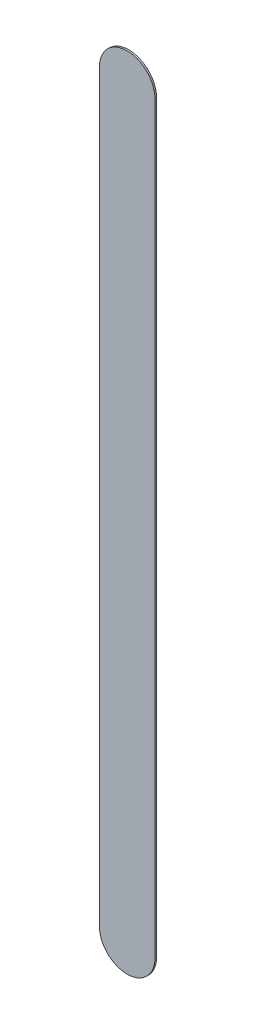
ISO-10303-21;
HEADER;
FILE_DESCRIPTION(('STEP AP214'),'2;1');
FILE_NAME('part.step','',(''),(''),'','','');
FILE_SCHEMA(('AUTOMOTIVE_DESIGN { 1 0 10303 214 1 1 1 1 }'));
ENDSEC;
DATA;
#1=APPLICATION_CONTEXT('core data for automotive mechanical design processes');
#2=APPLICATION_PROTOCOL_DEFINITION('international standard','automotive_design',2000,#1);
#3=PRODUCT_CONTEXT('',#1,'mechanical');
#4=PRODUCT('Part','Part','',(#3));
#5=PRODUCT_RELATED_PRODUCT_CATEGORY('part','',(#4));
#6=PRODUCT_DEFINITION_FORMATION('','',#4);
#7=PRODUCT_DEFINITION_CONTEXT('part definition',#1,'design');
#8=PRODUCT_DEFINITION('design','',#6,#7);
#9=PRODUCT_DEFINITION_SHAPE('','',#8);
#10=(LENGTH_UNIT() NAMED_UNIT(*) SI_UNIT(.MILLI.,.METRE.));
#11=(NAMED_UNIT(*) PLANE_ANGLE_UNIT() SI_UNIT($,.RADIAN.));
#12=(NAMED_UNIT(*) SI_UNIT($,.STERADIAN.) SOLID_ANGLE_UNIT());
#13=UNCERTAINTY_MEASURE_WITH_UNIT(LENGTH_MEASURE(1.E-05),#10,'distance_accuracy_value','');
#14=(GEOMETRIC_REPRESENTATION_CONTEXT(3) GLOBAL_UNCERTAINTY_ASSIGNED_CONTEXT((#13)) GLOBAL_UNIT_ASSIGNED_CONTEXT((#10,
#11,#12)) REPRESENTATION_CONTEXT('',''));
#15=CARTESIAN_POINT('',(0.,0.,0.));
#16=DIRECTION('',(0.,0.,1.));
#17=DIRECTION('',(1.,0.,0.));
#18=AXIS2_PLACEMENT_3D('',#15,#16,#17);
#19=CARTESIAN_POINT('',(122.99999784,77.04001864,0.));
#20=DIRECTION('',(-1.,0.,0.));
#21=DIRECTION('',(0.,1.,0.));
#22=AXIS2_PLACEMENT_3D('',#19,#20,#21);
#23=PLANE('',#22);
#24=DIRECTION('',(0.,1.,0.));
#25=VECTOR('',#24,1.);
#26=CARTESIAN_POINT('',(122.99999784,77.04001864,0.03556));
#27=LINE('',#26,#25);
#28=CARTESIAN_POINT('',(122.99999784,77.04001864,0.03556));
#29=VERTEX_POINT('',#28);
#30=CARTESIAN_POINT('',(122.99999784,93.10005256,0.03556));
#31=VERTEX_POINT('',#30);
#32=EDGE_CURVE('E11',#29,#31,#27,.T.);
#33=ORIENTED_EDGE('',*,*,#32,.F.);
#34=DIRECTION('',(0.,0.,1.));
#35=VECTOR('',#34,1.);
#36=CARTESIAN_POINT('',(122.99999784,77.04001864,0.));
#37=LINE('',#36,#35);
#38=CARTESIAN_POINT('',(122.99999784,77.04001864,0.));
#39=VERTEX_POINT('',#38);
#40=EDGE_CURVE('E24',#39,#29,#37,.T.);
#41=ORIENTED_EDGE('',*,*,#40,.F.);
#42=DIRECTION('',(0.,1.,0.));
#43=VECTOR('',#42,1.);
#44=CARTESIAN_POINT('',(122.99999784,77.04001864,0.));
#45=LINE('',#44,#43);
#46=CARTESIAN_POINT('',(122.99999784,93.10005256,0.));
#47=VERTEX_POINT('',#46);
#48=EDGE_CURVE('E75',#39,#47,#45,.T.);
#49=ORIENTED_EDGE('',*,*,#48,.T.);
#50=DIRECTION('',(0.,0.,1.));
#51=VECTOR('',#50,1.);
#52=CARTESIAN_POINT('',(122.99999784,93.10005256,0.));
#53=LINE('',#52,#51);
#54=EDGE_CURVE('E37',#47,#31,#53,.T.);
#55=ORIENTED_EDGE('',*,*,#54,.T.);
#56=EDGE_LOOP('',(#33,#41,#49,#55));
#57=FACE_BOUND('',#56,.T.);
#58=ADVANCED_FACE('F17',(#57),#23,.F.);
#59=CARTESIAN_POINT('',(122.39999904,93.10005256,0.));
#60=DIRECTION('',(0.,0.,-1.));
#61=DIRECTION('',(1.,0.,0.));
#62=AXIS2_PLACEMENT_3D('',#59,#60,#61);
#63=CYLINDRICAL_SURFACE('',#62,0.599998800000004);
#64=CARTESIAN_POINT('',(122.39999904,93.10005256,0.03556));
#65=DIRECTION('',(0.,0.,1.));
#66=DIRECTION('',(1.,0.,0.));
#67=AXIS2_PLACEMENT_3D('',#64,#65,#66);
#68=CIRCLE('',#67,0.599998800000004);
#69=CARTESIAN_POINT('',(121.80000024,93.10005256,0.03556));
#70=VERTEX_POINT('',#69);
#71=EDGE_CURVE('E83',#31,#70,#68,.T.);
#72=ORIENTED_EDGE('',*,*,#71,.F.);
#73=ORIENTED_EDGE('',*,*,#54,.F.);
#74=CARTESIAN_POINT('',(122.39999904,93.10005256,0.));
#75=DIRECTION('',(0.,0.,1.));
#76=DIRECTION('',(1.,0.,0.));
#77=AXIS2_PLACEMENT_3D('',#74,#75,#76);
#78=CIRCLE('',#77,0.599998800000004);
#79=CARTESIAN_POINT('',(121.80000024,93.10005256,0.));
#80=VERTEX_POINT('',#79);
#81=EDGE_CURVE('E81',#47,#80,#78,.T.);
#82=ORIENTED_EDGE('',*,*,#81,.T.);
#83=DIRECTION('',(0.,0.,1.));
#84=VECTOR('',#83,1.);
#85=CARTESIAN_POINT('',(121.80000024,93.10005256,0.));
#86=LINE('',#85,#84);
#87=EDGE_CURVE('E67',#80,#70,#86,.T.);
#88=ORIENTED_EDGE('',*,*,#87,.T.);
#89=EDGE_LOOP('',(#72,#73,#82,#88));
#90=FACE_BOUND('',#89,.T.);
#91=ADVANCED_FACE('F89',(#90),#63,.T.);
#92=CARTESIAN_POINT('',(121.80000024,93.10005256,0.));
#93=DIRECTION('',(1.,0.,0.));
#94=DIRECTION('',(0.,-1.,0.));
#95=AXIS2_PLACEMENT_3D('',#92,#93,#94);
#96=PLANE('',#95);
#97=DIRECTION('',(0.,-1.,0.));
#98=VECTOR('',#97,1.);
#99=CARTESIAN_POINT('',(121.80000024,93.10005256,0.03556));
#100=LINE('',#99,#98);
#101=CARTESIAN_POINT('',(121.80000024,77.04001864,0.03556));
#102=VERTEX_POINT('',#101);
#103=EDGE_CURVE('E71',#70,#102,#100,.T.);
#104=ORIENTED_EDGE('',*,*,#103,.F.);
#105=ORIENTED_EDGE('',*,*,#87,.F.);
#106=DIRECTION('',(0.,-1.,0.));
#107=VECTOR('',#106,1.);
#108=CARTESIAN_POINT('',(121.80000024,93.10005256,0.));
#109=LINE('',#108,#107);
#110=CARTESIAN_POINT('',(121.80000024,77.04001864,0.));
#111=VERTEX_POINT('',#110);
#112=EDGE_CURVE('E63',#80,#111,#109,.T.);
#113=ORIENTED_EDGE('',*,*,#112,.T.);
#114=DIRECTION('',(0.,0.,1.));
#115=VECTOR('',#114,1.);
#116=CARTESIAN_POINT('',(121.80000024,77.04001864,0.));
#117=LINE('',#116,#115);
#118=EDGE_CURVE('E53',#111,#102,#117,.T.);
#119=ORIENTED_EDGE('',*,*,#118,.T.);
#120=EDGE_LOOP('',(#104,#105,#113,#119));
#121=FACE_BOUND('',#120,.T.);
#122=ADVANCED_FACE('F66',(#121),#96,.F.);
#123=CARTESIAN_POINT('',(122.39999904,77.04001864,0.));
#124=DIRECTION('',(0.,0.,-1.));
#125=DIRECTION('',(-1.,0.,0.));
#126=AXIS2_PLACEMENT_3D('',#123,#124,#125);
#127=CYLINDRICAL_SURFACE('',#126,0.599998800000004);
#128=CARTESIAN_POINT('',(122.39999904,77.04001864,0.03556));
#129=DIRECTION('',(0.,0.,1.));
#130=DIRECTION('',(-1.,0.,0.));
#131=AXIS2_PLACEMENT_3D('',#128,#129,#130);
#132=CIRCLE('',#131,0.599998800000004);
#133=EDGE_CURVE('E59',#102,#29,#132,.T.);
#134=ORIENTED_EDGE('',*,*,#133,.F.);
#135=ORIENTED_EDGE('',*,*,#118,.F.);
#136=CARTESIAN_POINT('',(122.39999904,77.04001864,0.));
#137=DIRECTION('',(0.,0.,1.));
#138=DIRECTION('',(-1.,0.,0.));
#139=AXIS2_PLACEMENT_3D('',#136,#137,#138);
#140=CIRCLE('',#139,0.599998800000004);
#141=EDGE_CURVE('E57',#111,#39,#140,.T.);
#142=ORIENTED_EDGE('',*,*,#141,.T.);
#143=ORIENTED_EDGE('',*,*,#40,.T.);
#144=EDGE_LOOP('',(#134,#135,#142,#143));
#145=FACE_BOUND('',#144,.T.);
#146=ADVANCED_FACE('F55',(#145),#127,.T.);
#147=CARTESIAN_POINT('',(122.99999784,77.04001864,0.));
#148=DIRECTION('',(0.,0.,-1.));
#149=DIRECTION('',(-1.,0.,0.));
#150=AXIS2_PLACEMENT_3D('',#147,#148,#149);
#151=PLANE('',#150);
#152=ORIENTED_EDGE('',*,*,#141,.F.);
#153=ORIENTED_EDGE('',*,*,#112,.F.);
#154=ORIENTED_EDGE('',*,*,#81,.F.);
#155=ORIENTED_EDGE('',*,*,#48,.F.);
#156=EDGE_LOOP('',(#152,#153,#154,#155));
#157=FACE_BOUND('',#156,.T.);
#158=ADVANCED_FACE('F74',(#157),#151,.T.);
#159=CARTESIAN_POINT('',(122.99999784,77.04001864,0.03556));
#160=DIRECTION('',(0.,0.,-1.));
#161=DIRECTION('',(-1.,0.,0.));
#162=AXIS2_PLACEMENT_3D('',#159,#160,#161);
#163=PLANE('',#162);
#164=ORIENTED_EDGE('',*,*,#32,.T.);
#165=ORIENTED_EDGE('',*,*,#71,.T.);
#166=ORIENTED_EDGE('',*,*,#103,.T.);
#167=ORIENTED_EDGE('',*,*,#133,.T.);
#168=EDGE_LOOP('',(#164,#165,#166,#167));
#169=FACE_BOUND('',#168,.T.);
#170=ADVANCED_FACE('F91',(#169),#163,.F.);
#171=CLOSED_SHELL('',(#58,#91,#122,#146,#158,#170));
#172=MANIFOLD_SOLID_BREP('B1',#171);
#173=ADVANCED_BREP_SHAPE_REPRESENTATION('',(#18,#172),#14);
#174=SHAPE_DEFINITION_REPRESENTATION(#9,#173);
ENDSEC;
END-ISO-10303-21;
